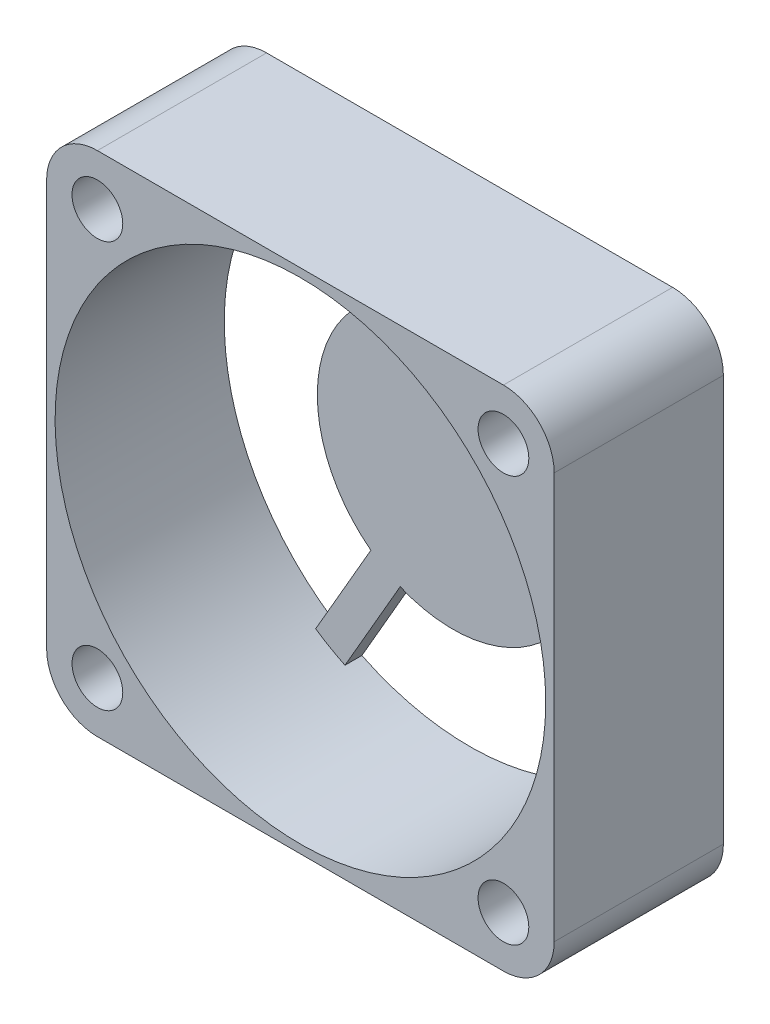
ISO-10303-21;
HEADER;
FILE_DESCRIPTION(('STEP AP214'),'2;1');
FILE_NAME('part.step','',(''),(''),'','','');
FILE_SCHEMA(('AUTOMOTIVE_DESIGN { 1 0 10303 214 1 1 1 1 }'));
ENDSEC;
DATA;
#1=APPLICATION_CONTEXT('core data for automotive mechanical design processes');
#2=APPLICATION_PROTOCOL_DEFINITION('international standard','automotive_design',2000,#1);
#3=PRODUCT_CONTEXT('',#1,'mechanical');
#4=PRODUCT('Part','Part','',(#3));
#5=PRODUCT_RELATED_PRODUCT_CATEGORY('part','',(#4));
#6=PRODUCT_DEFINITION_FORMATION('','',#4);
#7=PRODUCT_DEFINITION_CONTEXT('part definition',#1,'design');
#8=PRODUCT_DEFINITION('design','',#6,#7);
#9=PRODUCT_DEFINITION_SHAPE('','',#8);
#10=(LENGTH_UNIT() NAMED_UNIT(*) SI_UNIT(.MILLI.,.METRE.));
#11=(NAMED_UNIT(*) PLANE_ANGLE_UNIT() SI_UNIT($,.RADIAN.));
#12=(NAMED_UNIT(*) SI_UNIT($,.STERADIAN.) SOLID_ANGLE_UNIT());
#13=UNCERTAINTY_MEASURE_WITH_UNIT(LENGTH_MEASURE(1.E-05),#10,'distance_accuracy_value','');
#14=(GEOMETRIC_REPRESENTATION_CONTEXT(3) GLOBAL_UNCERTAINTY_ASSIGNED_CONTEXT((#13)) GLOBAL_UNIT_ASSIGNED_CONTEXT((#10,
#11,#12)) REPRESENTATION_CONTEXT('',''));
#15=CARTESIAN_POINT('',(0.,0.,0.));
#16=DIRECTION('',(0.,0.,1.));
#17=DIRECTION('',(1.,0.,0.));
#18=AXIS2_PLACEMENT_3D('',#15,#16,#17);
#19=CARTESIAN_POINT('',(0.,0.,10.));
#20=DIRECTION('',(0.,0.,-1.));
#21=DIRECTION('',(-1.,0.,0.));
#22=AXIS2_PLACEMENT_3D('',#19,#20,#21);
#23=CYLINDRICAL_SURFACE('',#22,14.5);
#24=CARTESIAN_POINT('',(0.,0.,10.));
#25=DIRECTION('',(0.,0.,1.));
#26=DIRECTION('',(1.,0.,0.));
#27=AXIS2_PLACEMENT_3D('',#24,#25,#26);
#28=CIRCLE('',#27,14.5);
#29=CARTESIAN_POINT('',(14.5,0.,10.));
#30=VERTEX_POINT('',#29);
#31=EDGE_CURVE('E262',#30,#30,#28,.T.);
#32=ORIENTED_EDGE('',*,*,#31,.T.);
#33=EDGE_LOOP('',(#32));
#34=FACE_BOUND('',#33,.T.);
#35=CARTESIAN_POINT('',(0.,0.,1.));
#36=DIRECTION('',(0.,0.,1.));
#37=DIRECTION('',(1.,0.,0.));
#38=AXIS2_PLACEMENT_3D('',#35,#36,#37);
#39=CIRCLE('',#38,14.5);
#40=CARTESIAN_POINT('',(-6.36671266696016,13.0274698163676,1.));
#41=VERTEX_POINT('',#40);
#42=CARTESIAN_POINT('',(-8.09876347452904,12.0274698163676,1.));
#43=VERTEX_POINT('',#42);
#44=EDGE_CURVE('E180',#41,#43,#39,.T.);
#45=ORIENTED_EDGE('',*,*,#44,.F.);
#46=DIRECTION('',(0.,0.,-1.));
#47=VECTOR('',#46,1.);
#48=CARTESIAN_POINT('',(-6.36671266696016,13.0274698163676,1.));
#49=LINE('',#48,#47);
#50=CARTESIAN_POINT('',(-6.36671266696016,13.0274698163676,0.));
#51=VERTEX_POINT('',#50);
#52=EDGE_CURVE('E191',#41,#51,#49,.T.);
#53=ORIENTED_EDGE('',*,*,#52,.T.);
#54=CARTESIAN_POINT('',(0.,0.,0.));
#55=DIRECTION('',(0.,0.,1.));
#56=DIRECTION('',(1.,0.,0.));
#57=AXIS2_PLACEMENT_3D('',#54,#55,#56);
#58=CIRCLE('',#57,14.5);
#59=CARTESIAN_POINT('',(14.4654761414894,1.,0.));
#60=VERTEX_POINT('',#59);
#61=EDGE_CURVE('E299',#60,#51,#58,.T.);
#62=ORIENTED_EDGE('',*,*,#61,.F.);
#63=DIRECTION('',(0.,0.,-1.));
#64=VECTOR('',#63,1.);
#65=CARTESIAN_POINT('',(14.4654761414894,1.,1.));
#66=LINE('',#65,#64);
#67=CARTESIAN_POINT('',(14.4654761414894,1.,1.));
#68=VERTEX_POINT('',#67);
#69=EDGE_CURVE('E240',#68,#60,#66,.T.);
#70=ORIENTED_EDGE('',*,*,#69,.F.);
#71=CARTESIAN_POINT('',(0.,0.,1.));
#72=DIRECTION('',(0.,0.,1.));
#73=DIRECTION('',(1.,0.,0.));
#74=AXIS2_PLACEMENT_3D('',#71,#72,#73);
#75=CIRCLE('',#74,14.5);
#76=CARTESIAN_POINT('',(14.4654761414894,-1.,1.));
#77=VERTEX_POINT('',#76);
#78=EDGE_CURVE('E219',#77,#68,#75,.T.);
#79=ORIENTED_EDGE('',*,*,#78,.F.);
#80=DIRECTION('',(0.,0.,-1.));
#81=VECTOR('',#80,1.);
#82=CARTESIAN_POINT('',(14.4654761414894,-1.,1.));
#83=LINE('',#82,#81);
#84=CARTESIAN_POINT('',(14.4654761414894,-1.,0.));
#85=VERTEX_POINT('',#84);
#86=EDGE_CURVE('E243',#77,#85,#83,.T.);
#87=ORIENTED_EDGE('',*,*,#86,.T.);
#88=CARTESIAN_POINT('',(-6.36671266696034,-13.0274698163675,0.));
#89=VERTEX_POINT('',#88);
#90=EDGE_CURVE('E198',#89,#85,#58,.T.);
#91=ORIENTED_EDGE('',*,*,#90,.F.);
#92=DIRECTION('',(0.,0.,-1.));
#93=VECTOR('',#92,1.);
#94=CARTESIAN_POINT('',(-6.36671266696034,-13.0274698163675,1.));
#95=LINE('',#94,#93);
#96=CARTESIAN_POINT('',(-6.36671266696034,-13.0274698163675,1.));
#97=VERTEX_POINT('',#96);
#98=EDGE_CURVE('E251',#97,#89,#95,.T.);
#99=ORIENTED_EDGE('',*,*,#98,.F.);
#100=CARTESIAN_POINT('',(0.,0.,1.));
#101=DIRECTION('',(0.,0.,1.));
#102=DIRECTION('',(1.,0.,0.));
#103=AXIS2_PLACEMENT_3D('',#100,#101,#102);
#104=CIRCLE('',#103,14.5);
#105=CARTESIAN_POINT('',(-8.09876347452921,-12.0274698163675,1.));
#106=VERTEX_POINT('',#105);
#107=EDGE_CURVE('E212',#106,#97,#104,.T.);
#108=ORIENTED_EDGE('',*,*,#107,.F.);
#109=DIRECTION('',(0.,0.,-1.));
#110=VECTOR('',#109,1.);
#111=CARTESIAN_POINT('',(-8.09876347452921,-12.0274698163675,1.));
#112=LINE('',#111,#110);
#113=CARTESIAN_POINT('',(-8.09876347452921,-12.0274698163675,0.));
#114=VERTEX_POINT('',#113);
#115=EDGE_CURVE('E253',#106,#114,#112,.T.);
#116=ORIENTED_EDGE('',*,*,#115,.T.);
#117=CARTESIAN_POINT('',(-8.09876347452904,12.0274698163676,0.));
#118=VERTEX_POINT('',#117);
#119=EDGE_CURVE('E302',#118,#114,#58,.T.);
#120=ORIENTED_EDGE('',*,*,#119,.F.);
#121=DIRECTION('',(0.,0.,-1.));
#122=VECTOR('',#121,1.);
#123=CARTESIAN_POINT('',(-8.09876347452904,12.0274698163676,1.));
#124=LINE('',#123,#122);
#125=EDGE_CURVE('E199',#43,#118,#124,.T.);
#126=ORIENTED_EDGE('',*,*,#125,.F.);
#127=EDGE_LOOP('',(#45,#53,#62,#70,#79,#87,#91,#99,#108,#116,#120,#126));
#128=FACE_BOUND('',#127,.T.);
#129=ADVANCED_FACE('F36',(#34,#128),#23,.F.);
#130=CARTESIAN_POINT('',(0.,15.,10.));
#131=DIRECTION('',(0.,-1.,0.));
#132=DIRECTION('',(0.,0.,-1.));
#133=AXIS2_PLACEMENT_3D('',#130,#131,#132);
#134=PLANE('',#133);
#135=DIRECTION('',(-1.,0.,0.));
#136=VECTOR('',#135,1.);
#137=CARTESIAN_POINT('',(0.,15.,0.));
#138=LINE('',#137,#136);
#139=CARTESIAN_POINT('',(12.,15.,0.));
#140=VERTEX_POINT('',#139);
#141=CARTESIAN_POINT('',(-12.,15.,0.));
#142=VERTEX_POINT('',#141);
#143=EDGE_CURVE('E314',#140,#142,#138,.T.);
#144=ORIENTED_EDGE('',*,*,#143,.T.);
#145=DIRECTION('',(0.,0.,-1.));
#146=VECTOR('',#145,1.);
#147=CARTESIAN_POINT('',(-12.,15.,10.));
#148=LINE('',#147,#146);
#149=CARTESIAN_POINT('',(-12.,15.,10.));
#150=VERTEX_POINT('',#149);
#151=EDGE_CURVE('E11',#150,#142,#148,.T.);
#152=ORIENTED_EDGE('',*,*,#151,.F.);
#153=DIRECTION('',(-1.,0.,0.));
#154=VECTOR('',#153,1.);
#155=CARTESIAN_POINT('',(0.,15.,10.));
#156=LINE('',#155,#154);
#157=CARTESIAN_POINT('',(12.,15.,10.));
#158=VERTEX_POINT('',#157);
#159=EDGE_CURVE('E278',#158,#150,#156,.T.);
#160=ORIENTED_EDGE('',*,*,#159,.F.);
#161=DIRECTION('',(0.,0.,-1.));
#162=VECTOR('',#161,1.);
#163=CARTESIAN_POINT('',(12.,15.,10.));
#164=LINE('',#163,#162);
#165=EDGE_CURVE('E298',#158,#140,#164,.T.);
#166=ORIENTED_EDGE('',*,*,#165,.T.);
#167=EDGE_LOOP('',(#144,#152,#160,#166));
#168=FACE_BOUND('',#167,.T.);
#169=ADVANCED_FACE('F371',(#168),#134,.F.);
#170=CARTESIAN_POINT('',(-12.,12.,10.));
#171=DIRECTION('',(0.,0.,-1.));
#172=DIRECTION('',(-1.,0.,0.));
#173=AXIS2_PLACEMENT_3D('',#170,#171,#172);
#174=CYLINDRICAL_SURFACE('',#173,3.);
#175=CARTESIAN_POINT('',(-12.,12.,0.));
#176=DIRECTION('',(0.,0.,1.));
#177=DIRECTION('',(1.,0.,0.));
#178=AXIS2_PLACEMENT_3D('',#175,#176,#177);
#179=CIRCLE('',#178,3.);
#180=CARTESIAN_POINT('',(-15.,12.,0.));
#181=VERTEX_POINT('',#180);
#182=EDGE_CURVE('E317',#142,#181,#179,.T.);
#183=ORIENTED_EDGE('',*,*,#182,.T.);
#184=DIRECTION('',(0.,0.,-1.));
#185=VECTOR('',#184,1.);
#186=CARTESIAN_POINT('',(-15.,12.,10.));
#187=LINE('',#186,#185);
#188=CARTESIAN_POINT('',(-15.,12.,10.));
#189=VERTEX_POINT('',#188);
#190=EDGE_CURVE('E43',#189,#181,#187,.T.);
#191=ORIENTED_EDGE('',*,*,#190,.F.);
#192=CARTESIAN_POINT('',(-12.,12.,10.));
#193=DIRECTION('',(0.,0.,1.));
#194=DIRECTION('',(1.,0.,0.));
#195=AXIS2_PLACEMENT_3D('',#192,#193,#194);
#196=CIRCLE('',#195,3.);
#197=EDGE_CURVE('E281',#150,#189,#196,.T.);
#198=ORIENTED_EDGE('',*,*,#197,.F.);
#199=ORIENTED_EDGE('',*,*,#151,.T.);
#200=EDGE_LOOP('',(#183,#191,#198,#199));
#201=FACE_BOUND('',#200,.T.);
#202=ADVANCED_FACE('F353',(#201),#174,.T.);
#203=CARTESIAN_POINT('',(-15.,0.,10.));
#204=DIRECTION('',(-1.,0.,0.));
#205=DIRECTION('',(0.,0.,1.));
#206=AXIS2_PLACEMENT_3D('',#203,#204,#205);
#207=PLANE('',#206);
#208=DIRECTION('',(0.,1.,0.));
#209=VECTOR('',#208,1.);
#210=CARTESIAN_POINT('',(-15.,0.,0.));
#211=LINE('',#210,#209);
#212=CARTESIAN_POINT('',(-15.,-12.,0.));
#213=VERTEX_POINT('',#212);
#214=EDGE_CURVE('E320',#213,#181,#211,.T.);
#215=ORIENTED_EDGE('',*,*,#214,.F.);
#216=DIRECTION('',(0.,0.,-1.));
#217=VECTOR('',#216,1.);
#218=CARTESIAN_POINT('',(-15.,-12.,10.));
#219=LINE('',#218,#217);
#220=CARTESIAN_POINT('',(-15.,-12.,10.));
#221=VERTEX_POINT('',#220);
#222=EDGE_CURVE('E346',#221,#213,#219,.T.);
#223=ORIENTED_EDGE('',*,*,#222,.F.);
#224=DIRECTION('',(0.,1.,0.));
#225=VECTOR('',#224,1.);
#226=CARTESIAN_POINT('',(-15.,0.,10.));
#227=LINE('',#226,#225);
#228=EDGE_CURVE('E283',#221,#189,#227,.T.);
#229=ORIENTED_EDGE('',*,*,#228,.T.);
#230=ORIENTED_EDGE('',*,*,#190,.T.);
#231=EDGE_LOOP('',(#215,#223,#229,#230));
#232=FACE_BOUND('',#231,.T.);
#233=ADVANCED_FACE('F350',(#232),#207,.T.);
#234=CARTESIAN_POINT('',(-12.,-12.,10.));
#235=DIRECTION('',(0.,0.,-1.));
#236=DIRECTION('',(-1.,0.,0.));
#237=AXIS2_PLACEMENT_3D('',#234,#235,#236);
#238=CYLINDRICAL_SURFACE('',#237,3.);
#239=CARTESIAN_POINT('',(-12.,-12.,0.));
#240=DIRECTION('',(0.,0.,1.));
#241=DIRECTION('',(1.,0.,0.));
#242=AXIS2_PLACEMENT_3D('',#239,#240,#241);
#243=CIRCLE('',#242,3.);
#244=CARTESIAN_POINT('',(-12.,-15.,0.));
#245=VERTEX_POINT('',#244);
#246=EDGE_CURVE('E323',#213,#245,#243,.T.);
#247=ORIENTED_EDGE('',*,*,#246,.T.);
#248=DIRECTION('',(0.,0.,-1.));
#249=VECTOR('',#248,1.);
#250=CARTESIAN_POINT('',(-12.,-15.,10.));
#251=LINE('',#250,#249);
#252=CARTESIAN_POINT('',(-12.,-15.,10.));
#253=VERTEX_POINT('',#252);
#254=EDGE_CURVE('E344',#253,#245,#251,.T.);
#255=ORIENTED_EDGE('',*,*,#254,.F.);
#256=CARTESIAN_POINT('',(-12.,-12.,10.));
#257=DIRECTION('',(0.,0.,1.));
#258=DIRECTION('',(1.,0.,0.));
#259=AXIS2_PLACEMENT_3D('',#256,#257,#258);
#260=CIRCLE('',#259,3.);
#261=EDGE_CURVE('E286',#221,#253,#260,.T.);
#262=ORIENTED_EDGE('',*,*,#261,.F.);
#263=ORIENTED_EDGE('',*,*,#222,.T.);
#264=EDGE_LOOP('',(#247,#255,#262,#263));
#265=FACE_BOUND('',#264,.T.);
#266=ADVANCED_FACE('F362',(#265),#238,.T.);
#267=CARTESIAN_POINT('',(0.,-15.,10.));
#268=DIRECTION('',(0.,-1.,0.));
#269=DIRECTION('',(0.,0.,-1.));
#270=AXIS2_PLACEMENT_3D('',#267,#268,#269);
#271=PLANE('',#270);
#272=DIRECTION('',(-1.,0.,0.));
#273=VECTOR('',#272,1.);
#274=CARTESIAN_POINT('',(0.,-15.,0.));
#275=LINE('',#274,#273);
#276=CARTESIAN_POINT('',(12.,-15.,0.));
#277=VERTEX_POINT('',#276);
#278=EDGE_CURVE('E326',#277,#245,#275,.T.);
#279=ORIENTED_EDGE('',*,*,#278,.F.);
#280=DIRECTION('',(0.,0.,-1.));
#281=VECTOR('',#280,1.);
#282=CARTESIAN_POINT('',(12.,-15.,10.));
#283=LINE('',#282,#281);
#284=CARTESIAN_POINT('',(12.,-15.,10.));
#285=VERTEX_POINT('',#284);
#286=EDGE_CURVE('E342',#285,#277,#283,.T.);
#287=ORIENTED_EDGE('',*,*,#286,.F.);
#288=DIRECTION('',(-1.,0.,0.));
#289=VECTOR('',#288,1.);
#290=CARTESIAN_POINT('',(0.,-15.,10.));
#291=LINE('',#290,#289);
#292=EDGE_CURVE('E288',#285,#253,#291,.T.);
#293=ORIENTED_EDGE('',*,*,#292,.T.);
#294=ORIENTED_EDGE('',*,*,#254,.T.);
#295=EDGE_LOOP('',(#279,#287,#293,#294));
#296=FACE_BOUND('',#295,.T.);
#297=ADVANCED_FACE('F385',(#296),#271,.T.);
#298=CARTESIAN_POINT('',(12.,-12.,10.));
#299=DIRECTION('',(0.,0.,-1.));
#300=DIRECTION('',(-1.,0.,0.));
#301=AXIS2_PLACEMENT_3D('',#298,#299,#300);
#302=CYLINDRICAL_SURFACE('',#301,3.);
#303=CARTESIAN_POINT('',(12.,-12.,0.));
#304=DIRECTION('',(0.,0.,1.));
#305=DIRECTION('',(1.,0.,0.));
#306=AXIS2_PLACEMENT_3D('',#303,#304,#305);
#307=CIRCLE('',#306,3.);
#308=CARTESIAN_POINT('',(15.,-12.,0.));
#309=VERTEX_POINT('',#308);
#310=EDGE_CURVE('E329',#309,#277,#307,.F.);
#311=ORIENTED_EDGE('',*,*,#310,.F.);
#312=DIRECTION('',(0.,0.,-1.));
#313=VECTOR('',#312,1.);
#314=CARTESIAN_POINT('',(15.,-12.,10.));
#315=LINE('',#314,#313);
#316=CARTESIAN_POINT('',(15.,-12.,10.));
#317=VERTEX_POINT('',#316);
#318=EDGE_CURVE('E340',#317,#309,#315,.T.);
#319=ORIENTED_EDGE('',*,*,#318,.F.);
#320=CARTESIAN_POINT('',(12.,-12.,10.));
#321=DIRECTION('',(0.,0.,1.));
#322=DIRECTION('',(1.,0.,0.));
#323=AXIS2_PLACEMENT_3D('',#320,#321,#322);
#324=CIRCLE('',#323,3.);
#325=EDGE_CURVE('E291',#317,#285,#324,.F.);
#326=ORIENTED_EDGE('',*,*,#325,.T.);
#327=ORIENTED_EDGE('',*,*,#286,.T.);
#328=EDGE_LOOP('',(#311,#319,#326,#327));
#329=FACE_BOUND('',#328,.T.);
#330=ADVANCED_FACE('F383',(#329),#302,.T.);
#331=CARTESIAN_POINT('',(15.,0.,10.));
#332=DIRECTION('',(-1.,0.,0.));
#333=DIRECTION('',(0.,0.,1.));
#334=AXIS2_PLACEMENT_3D('',#331,#332,#333);
#335=PLANE('',#334);
#336=DIRECTION('',(0.,1.,0.));
#337=VECTOR('',#336,1.);
#338=CARTESIAN_POINT('',(15.,0.,0.));
#339=LINE('',#338,#337);
#340=CARTESIAN_POINT('',(15.,12.,0.));
#341=VERTEX_POINT('',#340);
#342=EDGE_CURVE('E332',#309,#341,#339,.T.);
#343=ORIENTED_EDGE('',*,*,#342,.T.);
#344=DIRECTION('',(0.,0.,-1.));
#345=VECTOR('',#344,1.);
#346=CARTESIAN_POINT('',(15.,12.,10.));
#347=LINE('',#346,#345);
#348=CARTESIAN_POINT('',(15.,12.,10.));
#349=VERTEX_POINT('',#348);
#350=EDGE_CURVE('E337',#349,#341,#347,.T.);
#351=ORIENTED_EDGE('',*,*,#350,.F.);
#352=DIRECTION('',(0.,1.,0.));
#353=VECTOR('',#352,1.);
#354=CARTESIAN_POINT('',(15.,0.,10.));
#355=LINE('',#354,#353);
#356=EDGE_CURVE('E294',#317,#349,#355,.T.);
#357=ORIENTED_EDGE('',*,*,#356,.F.);
#358=ORIENTED_EDGE('',*,*,#318,.T.);
#359=EDGE_LOOP('',(#343,#351,#357,#358));
#360=FACE_BOUND('',#359,.T.);
#361=ADVANCED_FACE('F380',(#360),#335,.F.);
#362=CARTESIAN_POINT('',(-11.9999999999997,-12.,10.));
#363=DIRECTION('',(0.,0.,-1.));
#364=DIRECTION('',(-1.,0.,0.));
#365=AXIS2_PLACEMENT_3D('',#362,#363,#364);
#366=CYLINDRICAL_SURFACE('',#365,1.5);
#367=CARTESIAN_POINT('',(-11.9999999999997,-12.,10.));
#368=DIRECTION('',(0.,0.,1.));
#369=DIRECTION('',(1.,0.,0.));
#370=AXIS2_PLACEMENT_3D('',#367,#368,#369);
#371=CIRCLE('',#370,1.5);
#372=CARTESIAN_POINT('',(-10.4999999999997,-12.,10.));
#373=VERTEX_POINT('',#372);
#374=EDGE_CURVE('E275',#373,#373,#371,.T.);
#375=ORIENTED_EDGE('',*,*,#374,.T.);
#376=EDGE_LOOP('',(#375));
#377=FACE_BOUND('',#376,.T.);
#378=CARTESIAN_POINT('',(-11.9999999999997,-12.,0.));
#379=DIRECTION('',(0.,0.,1.));
#380=DIRECTION('',(1.,0.,0.));
#381=AXIS2_PLACEMENT_3D('',#378,#379,#380);
#382=CIRCLE('',#381,1.5);
#383=CARTESIAN_POINT('',(-10.4999999999997,-12.,0.));
#384=VERTEX_POINT('',#383);
#385=EDGE_CURVE('E311',#384,#384,#382,.T.);
#386=ORIENTED_EDGE('',*,*,#385,.F.);
#387=EDGE_LOOP('',(#386));
#388=FACE_BOUND('',#387,.T.);
#389=ADVANCED_FACE('F413',(#377,#388),#366,.F.);
#390=CARTESIAN_POINT('',(12.0000000000003,-12.,10.));
#391=DIRECTION('',(0.,0.,-1.));
#392=DIRECTION('',(-1.,0.,0.));
#393=AXIS2_PLACEMENT_3D('',#390,#391,#392);
#394=CYLINDRICAL_SURFACE('',#393,1.5);
#395=CARTESIAN_POINT('',(12.0000000000003,-12.,10.));
#396=DIRECTION('',(0.,0.,1.));
#397=DIRECTION('',(1.,0.,0.));
#398=AXIS2_PLACEMENT_3D('',#395,#396,#397);
#399=CIRCLE('',#398,1.5);
#400=CARTESIAN_POINT('',(13.5000000000003,-12.,10.));
#401=VERTEX_POINT('',#400);
#402=EDGE_CURVE('E272',#401,#401,#399,.T.);
#403=ORIENTED_EDGE('',*,*,#402,.T.);
#404=EDGE_LOOP('',(#403));
#405=FACE_BOUND('',#404,.T.);
#406=CARTESIAN_POINT('',(12.0000000000003,-12.,0.));
#407=DIRECTION('',(0.,0.,1.));
#408=DIRECTION('',(1.,0.,0.));
#409=AXIS2_PLACEMENT_3D('',#406,#407,#408);
#410=CIRCLE('',#409,1.5);
#411=CARTESIAN_POINT('',(13.5000000000003,-12.,0.));
#412=VERTEX_POINT('',#411);
#413=EDGE_CURVE('E308',#412,#412,#410,.T.);
#414=ORIENTED_EDGE('',*,*,#413,.F.);
#415=EDGE_LOOP('',(#414));
#416=FACE_BOUND('',#415,.T.);
#417=ADVANCED_FACE('F416',(#405,#416),#394,.F.);
#418=CARTESIAN_POINT('',(12.,12.,10.));
#419=DIRECTION('',(0.,0.,-1.));
#420=DIRECTION('',(-1.,0.,0.));
#421=AXIS2_PLACEMENT_3D('',#418,#419,#420);
#422=CYLINDRICAL_SURFACE('',#421,1.5);
#423=CARTESIAN_POINT('',(12.,12.,10.));
#424=DIRECTION('',(0.,0.,1.));
#425=DIRECTION('',(1.,0.,0.));
#426=AXIS2_PLACEMENT_3D('',#423,#424,#425);
#427=CIRCLE('',#426,1.5);
#428=CARTESIAN_POINT('',(13.5,12.,10.));
#429=VERTEX_POINT('',#428);
#430=EDGE_CURVE('E269',#429,#429,#427,.T.);
#431=ORIENTED_EDGE('',*,*,#430,.T.);
#432=EDGE_LOOP('',(#431));
#433=FACE_BOUND('',#432,.T.);
#434=CARTESIAN_POINT('',(12.,12.,0.));
#435=DIRECTION('',(0.,0.,1.));
#436=DIRECTION('',(1.,0.,0.));
#437=AXIS2_PLACEMENT_3D('',#434,#435,#436);
#438=CIRCLE('',#437,1.5);
#439=CARTESIAN_POINT('',(13.5,12.,0.));
#440=VERTEX_POINT('',#439);
#441=EDGE_CURVE('E305',#440,#440,#438,.T.);
#442=ORIENTED_EDGE('',*,*,#441,.F.);
#443=EDGE_LOOP('',(#442));
#444=FACE_BOUND('',#443,.T.);
#445=ADVANCED_FACE('F446',(#433,#444),#422,.F.);
#446=CARTESIAN_POINT('',(-12.,12.,10.));
#447=DIRECTION('',(0.,0.,-1.));
#448=DIRECTION('',(-1.,0.,0.));
#449=AXIS2_PLACEMENT_3D('',#446,#447,#448);
#450=CYLINDRICAL_SURFACE('',#449,1.5);
#451=CARTESIAN_POINT('',(-12.,12.,10.));
#452=DIRECTION('',(0.,0.,1.));
#453=DIRECTION('',(1.,0.,0.));
#454=AXIS2_PLACEMENT_3D('',#451,#452,#453);
#455=CIRCLE('',#454,1.5);
#456=CARTESIAN_POINT('',(-10.5,12.,10.));
#457=VERTEX_POINT('',#456);
#458=EDGE_CURVE('E265',#457,#457,#455,.T.);
#459=ORIENTED_EDGE('',*,*,#458,.T.);
#460=EDGE_LOOP('',(#459));
#461=FACE_BOUND('',#460,.T.);
#462=CARTESIAN_POINT('',(-12.,12.,0.));
#463=DIRECTION('',(0.,0.,1.));
#464=DIRECTION('',(1.,0.,0.));
#465=AXIS2_PLACEMENT_3D('',#462,#463,#464);
#466=CIRCLE('',#465,1.5);
#467=CARTESIAN_POINT('',(-10.5,12.,0.));
#468=VERTEX_POINT('',#467);
#469=EDGE_CURVE('E301',#468,#468,#466,.T.);
#470=ORIENTED_EDGE('',*,*,#469,.F.);
#471=EDGE_LOOP('',(#470));
#472=FACE_BOUND('',#471,.T.);
#473=ADVANCED_FACE('F430',(#461,#472),#450,.F.);
#474=CARTESIAN_POINT('',(12.,12.,10.));
#475=DIRECTION('',(0.,0.,-1.));
#476=DIRECTION('',(-1.,0.,0.));
#477=AXIS2_PLACEMENT_3D('',#474,#475,#476);
#478=CYLINDRICAL_SURFACE('',#477,3.);
#479=CARTESIAN_POINT('',(12.,12.,0.));
#480=DIRECTION('',(0.,0.,1.));
#481=DIRECTION('',(1.,0.,0.));
#482=AXIS2_PLACEMENT_3D('',#479,#480,#481);
#483=CIRCLE('',#482,3.);
#484=EDGE_CURVE('E266',#341,#140,#483,.T.);
#485=ORIENTED_EDGE('',*,*,#484,.T.);
#486=ORIENTED_EDGE('',*,*,#165,.F.);
#487=CARTESIAN_POINT('',(12.,12.,10.));
#488=DIRECTION('',(0.,0.,1.));
#489=DIRECTION('',(1.,0.,0.));
#490=AXIS2_PLACEMENT_3D('',#487,#488,#489);
#491=CIRCLE('',#490,3.);
#492=EDGE_CURVE('E296',#349,#158,#491,.T.);
#493=ORIENTED_EDGE('',*,*,#492,.F.);
#494=ORIENTED_EDGE('',*,*,#350,.T.);
#495=EDGE_LOOP('',(#485,#486,#493,#494));
#496=FACE_BOUND('',#495,.T.);
#497=ADVANCED_FACE('F376',(#496),#478,.T.);
#498=CARTESIAN_POINT('',(0.,0.,10.));
#499=DIRECTION('',(0.,0.,1.));
#500=DIRECTION('',(1.,0.,0.));
#501=AXIS2_PLACEMENT_3D('',#498,#499,#500);
#502=PLANE('',#501);
#503=ORIENTED_EDGE('',*,*,#31,.F.);
#504=EDGE_LOOP('',(#503));
#505=FACE_BOUND('',#504,.T.);
#506=ORIENTED_EDGE('',*,*,#458,.F.);
#507=EDGE_LOOP('',(#506));
#508=FACE_BOUND('',#507,.T.);
#509=ORIENTED_EDGE('',*,*,#430,.F.);
#510=EDGE_LOOP('',(#509));
#511=FACE_BOUND('',#510,.T.);
#512=ORIENTED_EDGE('',*,*,#402,.F.);
#513=EDGE_LOOP('',(#512));
#514=FACE_BOUND('',#513,.T.);
#515=ORIENTED_EDGE('',*,*,#374,.F.);
#516=EDGE_LOOP('',(#515));
#517=FACE_BOUND('',#516,.T.);
#518=ORIENTED_EDGE('',*,*,#159,.T.);
#519=ORIENTED_EDGE('',*,*,#197,.T.);
#520=ORIENTED_EDGE('',*,*,#228,.F.);
#521=ORIENTED_EDGE('',*,*,#261,.T.);
#522=ORIENTED_EDGE('',*,*,#292,.F.);
#523=ORIENTED_EDGE('',*,*,#325,.F.);
#524=ORIENTED_EDGE('',*,*,#356,.T.);
#525=ORIENTED_EDGE('',*,*,#492,.T.);
#526=EDGE_LOOP('',(#518,#519,#520,#521,#522,#523,#524,#525));
#527=FACE_BOUND('',#526,.T.);
#528=ADVANCED_FACE('F366',(#505,#508,#511,#514,#517,#527),#502,.T.);
#529=CARTESIAN_POINT('',(0.,0.,0.));
#530=DIRECTION('',(0.,0.,1.));
#531=DIRECTION('',(1.,0.,0.));
#532=AXIS2_PLACEMENT_3D('',#529,#530,#531);
#533=PLANE('',#532);
#534=DIRECTION('',(-0.499999999999992,0.866025403784443,0.));
#535=VECTOR('',#534,1.);
#536=CARTESIAN_POINT('',(-0.866025403784446,-0.499999999999993,0.));
#537=LINE('',#536,#535);
#538=CARTESIAN_POINT('',(-4.83465237038127,6.3738635424338,0.));
#539=VERTEX_POINT('',#538);
#540=EDGE_CURVE('E58',#539,#118,#537,.T.);
#541=ORIENTED_EDGE('',*,*,#540,.T.);
#542=ORIENTED_EDGE('',*,*,#119,.T.);
#543=DIRECTION('',(-0.500000000000004,-0.866025403784436,0.));
#544=VECTOR('',#543,1.);
#545=CARTESIAN_POINT('',(-0.866025403784437,0.500000000000005,0.));
#546=LINE('',#545,#544);
#547=CARTESIAN_POINT('',(-4.83465237038136,-6.37386354243374,0.));
#548=VERTEX_POINT('',#547);
#549=EDGE_CURVE('E228',#548,#114,#546,.T.);
#550=ORIENTED_EDGE('',*,*,#549,.F.);
#551=CARTESIAN_POINT('',(0.,0.,0.));
#552=DIRECTION('',(0.,0.,1.));
#553=DIRECTION('',(1.,0.,0.));
#554=AXIS2_PLACEMENT_3D('',#551,#552,#553);
#555=CIRCLE('',#554,8.);
#556=EDGE_CURVE('E226',#539,#548,#555,.T.);
#557=ORIENTED_EDGE('',*,*,#556,.F.);
#558=EDGE_LOOP('',(#541,#542,#550,#557));
#559=FACE_BOUND('',#558,.T.);
#560=DIRECTION('',(-0.500000000000004,-0.866025403784436,0.));
#561=VECTOR('',#560,1.);
#562=CARTESIAN_POINT('',(0.866025403784436,-0.500000000000004,0.));
#563=LINE('',#562,#561);
#564=CARTESIAN_POINT('',(-3.10260156281248,-7.37386354243375,0.));
#565=VERTEX_POINT('',#564);
#566=EDGE_CURVE('E50',#565,#89,#563,.T.);
#567=ORIENTED_EDGE('',*,*,#566,.T.);
#568=ORIENTED_EDGE('',*,*,#90,.T.);
#569=DIRECTION('',(1.,0.,0.));
#570=VECTOR('',#569,1.);
#571=CARTESIAN_POINT('',(0.,-1.,0.));
#572=LINE('',#571,#570);
#573=CARTESIAN_POINT('',(7.93725393319377,-1.,0.));
#574=VERTEX_POINT('',#573);
#575=EDGE_CURVE('E232',#574,#85,#572,.T.);
#576=ORIENTED_EDGE('',*,*,#575,.F.);
#577=EDGE_CURVE('E229',#565,#574,#555,.T.);
#578=ORIENTED_EDGE('',*,*,#577,.F.);
#579=EDGE_LOOP('',(#567,#568,#576,#578));
#580=FACE_BOUND('',#579,.T.);
#581=ORIENTED_EDGE('',*,*,#61,.T.);
#582=DIRECTION('',(-0.499999999999992,0.866025403784443,0.));
#583=VECTOR('',#582,1.);
#584=CARTESIAN_POINT('',(0.866025403784442,0.499999999999991,0.));
#585=LINE('',#584,#583);
#586=CARTESIAN_POINT('',(-3.10260156281238,7.37386354243379,0.));
#587=VERTEX_POINT('',#586);
#588=EDGE_CURVE('E194',#587,#51,#585,.T.);
#589=ORIENTED_EDGE('',*,*,#588,.F.);
#590=CARTESIAN_POINT('',(7.93725393319377,1.,0.));
#591=VERTEX_POINT('',#590);
#592=EDGE_CURVE('E188',#591,#587,#555,.T.);
#593=ORIENTED_EDGE('',*,*,#592,.F.);
#594=DIRECTION('',(1.,0.,0.));
#595=VECTOR('',#594,1.);
#596=CARTESIAN_POINT('',(0.,1.,0.));
#597=LINE('',#596,#595);
#598=EDGE_CURVE('E234',#591,#60,#597,.T.);
#599=ORIENTED_EDGE('',*,*,#598,.T.);
#600=EDGE_LOOP('',(#581,#589,#593,#599));
#601=FACE_BOUND('',#600,.T.);
#602=ORIENTED_EDGE('',*,*,#469,.T.);
#603=EDGE_LOOP('',(#602));
#604=FACE_BOUND('',#603,.T.);
#605=ORIENTED_EDGE('',*,*,#441,.T.);
#606=EDGE_LOOP('',(#605));
#607=FACE_BOUND('',#606,.T.);
#608=ORIENTED_EDGE('',*,*,#413,.T.);
#609=EDGE_LOOP('',(#608));
#610=FACE_BOUND('',#609,.T.);
#611=ORIENTED_EDGE('',*,*,#385,.T.);
#612=EDGE_LOOP('',(#611));
#613=FACE_BOUND('',#612,.T.);
#614=ORIENTED_EDGE('',*,*,#143,.F.);
#615=ORIENTED_EDGE('',*,*,#484,.F.);
#616=ORIENTED_EDGE('',*,*,#342,.F.);
#617=ORIENTED_EDGE('',*,*,#310,.T.);
#618=ORIENTED_EDGE('',*,*,#278,.T.);
#619=ORIENTED_EDGE('',*,*,#246,.F.);
#620=ORIENTED_EDGE('',*,*,#214,.T.);
#621=ORIENTED_EDGE('',*,*,#182,.F.);
#622=EDGE_LOOP('',(#614,#615,#616,#617,#618,#619,#620,#621));
#623=FACE_BOUND('',#622,.T.);
#624=ADVANCED_FACE('F358',(#559,#580,#601,#604,#607,#610,#613,#623),#533,.F.);
#625=CARTESIAN_POINT('',(0.866025403784442,0.499999999999991,1.));
#626=DIRECTION('',(-0.866025403784443,-0.499999999999992,0.));
#627=DIRECTION('',(0.499999999999992,-0.866025403784443,0.));
#628=AXIS2_PLACEMENT_3D('',#625,#626,#627);
#629=PLANE('',#628);
#630=ORIENTED_EDGE('',*,*,#588,.T.);
#631=ORIENTED_EDGE('',*,*,#52,.F.);
#632=DIRECTION('',(-0.499999999999992,0.866025403784443,0.));
#633=VECTOR('',#632,1.);
#634=CARTESIAN_POINT('',(0.866025403784442,0.499999999999991,1.));
#635=LINE('',#634,#633);
#636=CARTESIAN_POINT('',(-3.10260156281238,7.37386354243379,1.));
#637=VERTEX_POINT('',#636);
#638=EDGE_CURVE('E175',#637,#41,#635,.T.);
#639=ORIENTED_EDGE('',*,*,#638,.F.);
#640=DIRECTION('',(0.,0.,-1.));
#641=VECTOR('',#640,1.);
#642=CARTESIAN_POINT('',(-3.10260156281238,7.37386354243379,1.));
#643=LINE('',#642,#641);
#644=EDGE_CURVE('E236',#637,#587,#643,.T.);
#645=ORIENTED_EDGE('',*,*,#644,.T.);
#646=EDGE_LOOP('',(#630,#631,#639,#645));
#647=FACE_BOUND('',#646,.T.);
#648=ADVANCED_FACE('F192',(#647),#629,.F.);
#649=CARTESIAN_POINT('',(-0.866025403784446,-0.499999999999993,1.));
#650=DIRECTION('',(-0.866025403784443,-0.499999999999992,0.));
#651=DIRECTION('',(0.499999999999992,-0.866025403784443,0.));
#652=AXIS2_PLACEMENT_3D('',#649,#650,#651);
#653=PLANE('',#652);
#654=ORIENTED_EDGE('',*,*,#540,.F.);
#655=DIRECTION('',(0.,0.,-1.));
#656=VECTOR('',#655,1.);
#657=CARTESIAN_POINT('',(-4.83465237038127,6.3738635424338,1.));
#658=LINE('',#657,#656);
#659=CARTESIAN_POINT('',(-4.83465237038127,6.3738635424338,1.));
#660=VERTEX_POINT('',#659);
#661=EDGE_CURVE('E259',#660,#539,#658,.T.);
#662=ORIENTED_EDGE('',*,*,#661,.F.);
#663=DIRECTION('',(-0.499999999999992,0.866025403784443,0.));
#664=VECTOR('',#663,1.);
#665=CARTESIAN_POINT('',(-0.866025403784446,-0.499999999999993,1.));
#666=LINE('',#665,#664);
#667=EDGE_CURVE('E203',#660,#43,#666,.T.);
#668=ORIENTED_EDGE('',*,*,#667,.T.);
#669=ORIENTED_EDGE('',*,*,#125,.T.);
#670=EDGE_LOOP('',(#654,#662,#668,#669));
#671=FACE_BOUND('',#670,.T.);
#672=ADVANCED_FACE('F425',(#671),#653,.T.);
#673=CARTESIAN_POINT('',(0.,0.,1.));
#674=DIRECTION('',(0.,0.,-1.));
#675=DIRECTION('',(-1.,0.,0.));
#676=AXIS2_PLACEMENT_3D('',#673,#674,#675);
#677=CYLINDRICAL_SURFACE('',#676,8.);
#678=ORIENTED_EDGE('',*,*,#556,.T.);
#679=DIRECTION('',(0.,0.,-1.));
#680=VECTOR('',#679,1.);
#681=CARTESIAN_POINT('',(-4.83465237038136,-6.37386354243374,1.));
#682=LINE('',#681,#680);
#683=CARTESIAN_POINT('',(-4.83465237038136,-6.37386354243374,1.));
#684=VERTEX_POINT('',#683);
#685=EDGE_CURVE('E256',#684,#548,#682,.T.);
#686=ORIENTED_EDGE('',*,*,#685,.F.);
#687=CARTESIAN_POINT('',(0.,0.,1.));
#688=DIRECTION('',(0.,0.,1.));
#689=DIRECTION('',(1.,0.,0.));
#690=AXIS2_PLACEMENT_3D('',#687,#688,#689);
#691=CIRCLE('',#690,8.);
#692=EDGE_CURVE('E205',#660,#684,#691,.T.);
#693=ORIENTED_EDGE('',*,*,#692,.F.);
#694=ORIENTED_EDGE('',*,*,#661,.T.);
#695=EDGE_LOOP('',(#678,#686,#693,#694));
#696=FACE_BOUND('',#695,.T.);
#697=ADVANCED_FACE('F495',(#696),#677,.T.);
#698=CARTESIAN_POINT('',(-0.866025403784437,0.500000000000005,1.));
#699=DIRECTION('',(0.866025403784436,-0.500000000000004,0.));
#700=DIRECTION('',(0.500000000000004,0.866025403784436,0.));
#701=AXIS2_PLACEMENT_3D('',#698,#699,#700);
#702=PLANE('',#701);
#703=ORIENTED_EDGE('',*,*,#549,.T.);
#704=ORIENTED_EDGE('',*,*,#115,.F.);
#705=DIRECTION('',(-0.500000000000004,-0.866025403784436,0.));
#706=VECTOR('',#705,1.);
#707=CARTESIAN_POINT('',(-0.866025403784437,0.500000000000005,1.));
#708=LINE('',#707,#706);
#709=EDGE_CURVE('E209',#684,#106,#708,.T.);
#710=ORIENTED_EDGE('',*,*,#709,.F.);
#711=ORIENTED_EDGE('',*,*,#685,.T.);
#712=EDGE_LOOP('',(#703,#704,#710,#711));
#713=FACE_BOUND('',#712,.T.);
#714=ADVANCED_FACE('F505',(#713),#702,.F.);
#715=CARTESIAN_POINT('',(0.866025403784436,-0.500000000000004,1.));
#716=DIRECTION('',(0.866025403784436,-0.500000000000004,0.));
#717=DIRECTION('',(0.500000000000004,0.866025403784436,0.));
#718=AXIS2_PLACEMENT_3D('',#715,#716,#717);
#719=PLANE('',#718);
#720=ORIENTED_EDGE('',*,*,#566,.F.);
#721=DIRECTION('',(0.,0.,-1.));
#722=VECTOR('',#721,1.);
#723=CARTESIAN_POINT('',(-3.10260156281248,-7.37386354243375,1.));
#724=LINE('',#723,#722);
#725=CARTESIAN_POINT('',(-3.10260156281248,-7.37386354243375,1.));
#726=VERTEX_POINT('',#725);
#727=EDGE_CURVE('E249',#726,#565,#724,.T.);
#728=ORIENTED_EDGE('',*,*,#727,.F.);
#729=DIRECTION('',(-0.500000000000004,-0.866025403784436,0.));
#730=VECTOR('',#729,1.);
#731=CARTESIAN_POINT('',(0.866025403784436,-0.500000000000004,1.));
#732=LINE('',#731,#730);
#733=EDGE_CURVE('E214',#726,#97,#732,.T.);
#734=ORIENTED_EDGE('',*,*,#733,.T.);
#735=ORIENTED_EDGE('',*,*,#98,.T.);
#736=EDGE_LOOP('',(#720,#728,#734,#735));
#737=FACE_BOUND('',#736,.T.);
#738=ADVANCED_FACE('F517',(#737),#719,.T.);
#739=ORIENTED_EDGE('',*,*,#577,.T.);
#740=DIRECTION('',(0.,0.,-1.));
#741=VECTOR('',#740,1.);
#742=CARTESIAN_POINT('',(7.93725393319377,-1.,1.));
#743=LINE('',#742,#741);
#744=CARTESIAN_POINT('',(7.93725393319377,-1.,1.));
#745=VERTEX_POINT('',#744);
#746=EDGE_CURVE('E246',#745,#574,#743,.T.);
#747=ORIENTED_EDGE('',*,*,#746,.F.);
#748=EDGE_CURVE('E210',#726,#745,#691,.T.);
#749=ORIENTED_EDGE('',*,*,#748,.F.);
#750=ORIENTED_EDGE('',*,*,#727,.T.);
#751=EDGE_LOOP('',(#739,#747,#749,#750));
#752=FACE_BOUND('',#751,.T.);
#753=ADVANCED_FACE('F508',(#752),#677,.T.);
#754=CARTESIAN_POINT('',(0.,-1.,1.));
#755=DIRECTION('',(0.,1.,0.));
#756=DIRECTION('',(0.,0.,1.));
#757=AXIS2_PLACEMENT_3D('',#754,#755,#756);
#758=PLANE('',#757);
#759=ORIENTED_EDGE('',*,*,#575,.T.);
#760=ORIENTED_EDGE('',*,*,#86,.F.);
#761=DIRECTION('',(1.,0.,0.));
#762=VECTOR('',#761,1.);
#763=CARTESIAN_POINT('',(0.,-1.,1.));
#764=LINE('',#763,#762);
#765=EDGE_CURVE('E217',#745,#77,#764,.T.);
#766=ORIENTED_EDGE('',*,*,#765,.F.);
#767=ORIENTED_EDGE('',*,*,#746,.T.);
#768=EDGE_LOOP('',(#759,#760,#766,#767));
#769=FACE_BOUND('',#768,.T.);
#770=ADVANCED_FACE('F536',(#769),#758,.F.);
#771=CARTESIAN_POINT('',(0.,1.,1.));
#772=DIRECTION('',(0.,1.,0.));
#773=DIRECTION('',(0.,0.,1.));
#774=AXIS2_PLACEMENT_3D('',#771,#772,#773);
#775=PLANE('',#774);
#776=ORIENTED_EDGE('',*,*,#598,.F.);
#777=DIRECTION('',(0.,0.,-1.));
#778=VECTOR('',#777,1.);
#779=CARTESIAN_POINT('',(7.93725393319377,1.,1.));
#780=LINE('',#779,#778);
#781=CARTESIAN_POINT('',(7.93725393319377,1.,1.));
#782=VERTEX_POINT('',#781);
#783=EDGE_CURVE('E238',#782,#591,#780,.T.);
#784=ORIENTED_EDGE('',*,*,#783,.F.);
#785=DIRECTION('',(1.,0.,0.));
#786=VECTOR('',#785,1.);
#787=CARTESIAN_POINT('',(0.,1.,1.));
#788=LINE('',#787,#786);
#789=EDGE_CURVE('E221',#782,#68,#788,.T.);
#790=ORIENTED_EDGE('',*,*,#789,.T.);
#791=ORIENTED_EDGE('',*,*,#69,.T.);
#792=EDGE_LOOP('',(#776,#784,#790,#791));
#793=FACE_BOUND('',#792,.T.);
#794=ADVANCED_FACE('F545',(#793),#775,.T.);
#795=ORIENTED_EDGE('',*,*,#592,.T.);
#796=ORIENTED_EDGE('',*,*,#644,.F.);
#797=EDGE_CURVE('E184',#782,#637,#691,.T.);
#798=ORIENTED_EDGE('',*,*,#797,.F.);
#799=ORIENTED_EDGE('',*,*,#783,.T.);
#800=EDGE_LOOP('',(#795,#796,#798,#799));
#801=FACE_BOUND('',#800,.T.);
#802=ADVANCED_FACE('F509',(#801),#677,.T.);
#803=CARTESIAN_POINT('',(0.,0.,1.));
#804=DIRECTION('',(0.,0.,1.));
#805=DIRECTION('',(1.,0.,0.));
#806=AXIS2_PLACEMENT_3D('',#803,#804,#805);
#807=PLANE('',#806);
#808=ORIENTED_EDGE('',*,*,#638,.T.);
#809=ORIENTED_EDGE('',*,*,#44,.T.);
#810=ORIENTED_EDGE('',*,*,#667,.F.);
#811=ORIENTED_EDGE('',*,*,#692,.T.);
#812=ORIENTED_EDGE('',*,*,#709,.T.);
#813=ORIENTED_EDGE('',*,*,#107,.T.);
#814=ORIENTED_EDGE('',*,*,#733,.F.);
#815=ORIENTED_EDGE('',*,*,#748,.T.);
#816=ORIENTED_EDGE('',*,*,#765,.T.);
#817=ORIENTED_EDGE('',*,*,#78,.T.);
#818=ORIENTED_EDGE('',*,*,#789,.F.);
#819=ORIENTED_EDGE('',*,*,#797,.T.);
#820=EDGE_LOOP('',(#808,#809,#810,#811,#812,#813,#814,#815,#816,#817,#818,#819));
#821=FACE_BOUND('',#820,.T.);
#822=ADVANCED_FACE('F177',(#821),#807,.T.);
#823=CLOSED_SHELL('',(#129,#169,#202,#233,#266,#297,#330,#361,#389,#417,#445,#473,#497,#528,
#624,#648,#672,#697,#714,#738,#753,#770,#794,#802,#822));
#824=MANIFOLD_SOLID_BREP('B2',#823);
#825=ADVANCED_BREP_SHAPE_REPRESENTATION('',(#18,#824),#14);
#826=SHAPE_DEFINITION_REPRESENTATION(#9,#825);
ENDSEC;
END-ISO-10303-21;
